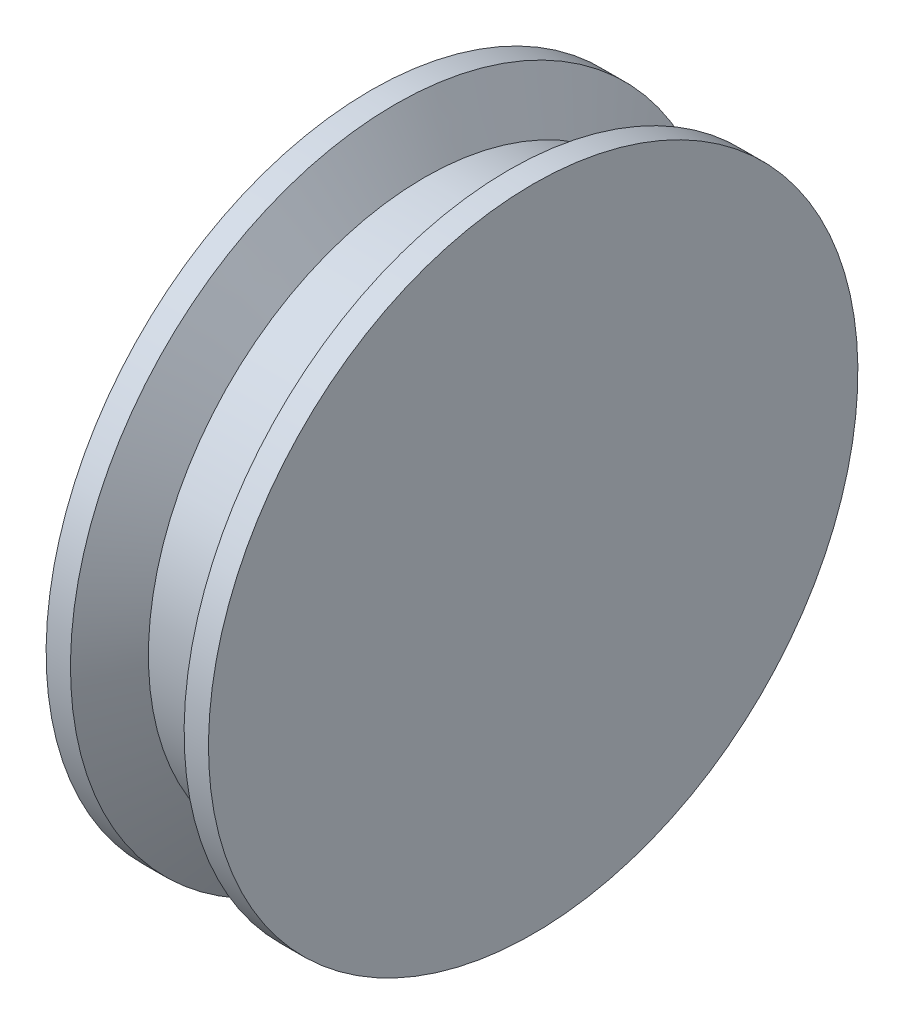
ISO-10303-21;
HEADER;
FILE_DESCRIPTION(('STEP AP214'),'2;1');
FILE_NAME('part.step','',(''),(''),'','','');
FILE_SCHEMA(('AUTOMOTIVE_DESIGN { 1 0 10303 214 1 1 1 1 }'));
ENDSEC;
DATA;
#1=APPLICATION_CONTEXT('core data for automotive mechanical design processes');
#2=APPLICATION_PROTOCOL_DEFINITION('international standard','automotive_design',2000,#1);
#3=PRODUCT_CONTEXT('',#1,'mechanical');
#4=PRODUCT('Part','Part','',(#3));
#5=PRODUCT_RELATED_PRODUCT_CATEGORY('part','',(#4));
#6=PRODUCT_DEFINITION_FORMATION('','',#4);
#7=PRODUCT_DEFINITION_CONTEXT('part definition',#1,'design');
#8=PRODUCT_DEFINITION('design','',#6,#7);
#9=PRODUCT_DEFINITION_SHAPE('','',#8);
#10=(LENGTH_UNIT() NAMED_UNIT(*) SI_UNIT(.MILLI.,.METRE.));
#11=(NAMED_UNIT(*) PLANE_ANGLE_UNIT() SI_UNIT($,.RADIAN.));
#12=(NAMED_UNIT(*) SI_UNIT($,.STERADIAN.) SOLID_ANGLE_UNIT());
#13=UNCERTAINTY_MEASURE_WITH_UNIT(LENGTH_MEASURE(1.E-05),#10,'distance_accuracy_value','');
#14=(GEOMETRIC_REPRESENTATION_CONTEXT(3) GLOBAL_UNCERTAINTY_ASSIGNED_CONTEXT((#13)) GLOBAL_UNIT_ASSIGNED_CONTEXT((#10,
#11,#12)) REPRESENTATION_CONTEXT('',''));
#15=CARTESIAN_POINT('',(0.,0.,0.));
#16=DIRECTION('',(0.,0.,1.));
#17=DIRECTION('',(1.,0.,0.));
#18=AXIS2_PLACEMENT_3D('',#15,#16,#17);
#19=CARTESIAN_POINT('',(-131.316498316498,-36.0083067887729,0.));
#20=DIRECTION('',(-1.,0.,0.));
#21=DIRECTION('',(0.,-1.,0.));
#22=AXIS2_PLACEMENT_3D('',#19,#20,#21);
#23=PLANE('',#22);
#24=CARTESIAN_POINT('',(-131.316498316498,-36.0083067887729,0.));
#25=DIRECTION('',(1.,0.,0.));
#26=DIRECTION('',(0.,1.,0.));
#27=AXIS2_PLACEMENT_3D('',#24,#25,#26);
#28=CIRCLE('',#27,200.);
#29=CARTESIAN_POINT('',(-131.316498316498,163.991693211227,0.));
#30=VERTEX_POINT('',#29);
#31=EDGE_CURVE('E146',#30,#30,#28,.T.);
#32=ORIENTED_EDGE('',*,*,#31,.F.);
#33=EDGE_LOOP('',(#32));
#34=FACE_BOUND('',#33,.T.);
#35=CARTESIAN_POINT('',(-131.316498316498,-36.0083067887729,0.));
#36=DIRECTION('',(-1.,0.,0.));
#37=DIRECTION('',(0.,-1.,0.));
#38=AXIS2_PLACEMENT_3D('',#35,#36,#37);
#39=CIRCLE('',#38,10.);
#40=CARTESIAN_POINT('',(-131.316498316498,-41.0083067887729,-8.66025403784439));
#41=VERTEX_POINT('',#40);
#42=CARTESIAN_POINT('',(-131.316498316498,-31.0083067887729,-8.6602540378444));
#43=VERTEX_POINT('',#42);
#44=EDGE_CURVE('E117',#41,#43,#39,.T.);
#45=ORIENTED_EDGE('',*,*,#44,.F.);
#46=DIRECTION('',(0.,0.,1.));
#47=VECTOR('',#46,1.);
#48=CARTESIAN_POINT('',(-131.316498316498,-41.0083067887729,-14.));
#49=LINE('',#48,#47);
#50=CARTESIAN_POINT('',(-131.316498316498,-41.0083067887729,-14.));
#51=VERTEX_POINT('',#50);
#52=EDGE_CURVE('E94',#51,#41,#49,.T.);
#53=ORIENTED_EDGE('',*,*,#52,.F.);
#54=DIRECTION('',(0.,1.,0.));
#55=VECTOR('',#54,1.);
#56=CARTESIAN_POINT('',(-131.316498316498,7.28952999720633E-13,-14.));
#57=LINE('',#56,#55);
#58=CARTESIAN_POINT('',(-131.316498316498,-31.0083067887729,-14.));
#59=VERTEX_POINT('',#58);
#60=EDGE_CURVE('E87',#51,#59,#57,.T.);
#61=ORIENTED_EDGE('',*,*,#60,.T.);
#62=DIRECTION('',(0.,0.,1.));
#63=VECTOR('',#62,1.);
#64=CARTESIAN_POINT('',(-131.316498316498,-31.0083067887729,-14.));
#65=LINE('',#64,#63);
#66=EDGE_CURVE('E97',#59,#43,#65,.T.);
#67=ORIENTED_EDGE('',*,*,#66,.T.);
#68=EDGE_LOOP('',(#45,#53,#61,#67));
#69=FACE_BOUND('',#68,.T.);
#70=ADVANCED_FACE('F41',(#34,#69),#23,.T.);
#71=CARTESIAN_POINT('',(-91.3164983164983,-36.0083067887728,0.));
#72=DIRECTION('',(-1.,0.,0.));
#73=DIRECTION('',(0.,-1.,0.));
#74=AXIS2_PLACEMENT_3D('',#71,#72,#73);
#75=CYLINDRICAL_SURFACE('',#74,10.);
#76=CARTESIAN_POINT('',(-91.3164983164983,-36.0083067887728,0.));
#77=DIRECTION('',(-1.,0.,0.));
#78=DIRECTION('',(0.,-1.,0.));
#79=AXIS2_PLACEMENT_3D('',#76,#77,#78);
#80=CIRCLE('',#79,10.);
#81=CARTESIAN_POINT('',(-91.3164983164983,-46.0083067887728,0.));
#82=VERTEX_POINT('',#81);
#83=EDGE_CURVE('E120',#82,#82,#80,.T.);
#84=ORIENTED_EDGE('',*,*,#83,.F.);
#85=EDGE_LOOP('',(#84));
#86=FACE_BOUND('',#85,.T.);
#87=DIRECTION('',(-1.,0.,0.));
#88=VECTOR('',#87,1.);
#89=CARTESIAN_POINT('',(-91.3164983164983,-41.0083067887729,-8.66025403784438));
#90=LINE('',#89,#88);
#91=CARTESIAN_POINT('',(-101.316498316498,-41.0083067887729,-8.66025403784438));
#92=VERTEX_POINT('',#91);
#93=EDGE_CURVE('E63',#92,#41,#90,.T.);
#94=ORIENTED_EDGE('',*,*,#93,.T.);
#95=ORIENTED_EDGE('',*,*,#44,.T.);
#96=DIRECTION('',(-1.,0.,0.));
#97=VECTOR('',#96,1.);
#98=CARTESIAN_POINT('',(-91.3164983164983,-31.0083067887729,-8.66025403784441));
#99=LINE('',#98,#97);
#100=CARTESIAN_POINT('',(-101.316498316498,-31.0083067887729,-8.6602540378444));
#101=VERTEX_POINT('',#100);
#102=EDGE_CURVE('E11',#43,#101,#99,.F.);
#103=ORIENTED_EDGE('',*,*,#102,.T.);
#104=CARTESIAN_POINT('',(-101.316498316498,-31.0083067887729,-8.6602540378444));
#105=CARTESIAN_POINT('',(-101.185553457075,-31.0082831747662,-8.66021552033595));
#106=CARTESIAN_POINT('',(-101.054629982263,-31.0134499334058,-8.66322292251227));
#107=CARTESIAN_POINT('',(-100.793926511494,-31.0339784341393,-8.67503956566088));
#108=CARTESIAN_POINT('',(-100.66414586259,-31.0493339124086,-8.68384524194289));
#109=CARTESIAN_POINT('',(-100.407403261575,-31.0899378118031,-8.70690282410306));
#110=CARTESIAN_POINT('',(-100.280429417459,-31.1151290274678,-8.72112322585305));
#111=CARTESIAN_POINT('',(-100.029443051431,-31.1750723583759,-8.75448565934705));
#112=CARTESIAN_POINT('',(-99.9054308714465,-31.2098255718177,-8.77362825639016));
#113=CARTESIAN_POINT('',(-99.5395705265123,-31.3277125700236,-8.83742418586506));
#114=CARTESIAN_POINT('',(-99.3031219511272,-31.4245992069742,-8.88852160837801));
#115=CARTESIAN_POINT('',(-98.8496629532383,-31.6517848718816,-9.00204283953055));
#116=CARTESIAN_POINT('',(-98.6326833590886,-31.7821356715433,-9.06448415391185));
#117=CARTESIAN_POINT('',(-98.2049621942789,-32.0849792557353,-9.19984832177621));
#118=CARTESIAN_POINT('',(-97.9961822715222,-32.2600468042289,-9.27321075223626));
#119=CARTESIAN_POINT('',(-97.6093889678006,-32.6421242581258,-9.4186245679303));
#120=CARTESIAN_POINT('',(-97.4313839339349,-32.8491428008968,-9.49067559274422));
#121=CARTESIAN_POINT('',(-97.1852722945067,-33.1879741621137,-9.5948442553227));
#122=CARTESIAN_POINT('',(-97.104585925138,-33.3099237169127,-9.62993521302806));
#123=CARTESIAN_POINT('',(-96.953870889154,-33.5610832961431,-9.69680101193731));
#124=CARTESIAN_POINT('',(-96.8838379989103,-33.6902904153103,-9.72857716573445));
#125=CARTESIAN_POINT('',(-96.7551232328078,-33.9551302811057,-9.7878946678277));
#126=CARTESIAN_POINT('',(-96.6964385104885,-34.0907614057471,-9.81543707771721));
#127=CARTESIAN_POINT('',(-96.5910676555497,-34.3675087462858,-9.86547225261225));
#128=CARTESIAN_POINT('',(-96.5443802474515,-34.5086243772671,-9.88796555437484));
#129=CARTESIAN_POINT('',(-96.4664831104079,-34.7850013354591,-9.92580345064966));
#130=CARTESIAN_POINT('',(-96.4344087311045,-34.9199652095616,-9.94154270016939));
#131=CARTESIAN_POINT('',(-96.3815326605929,-35.1925931192453,-9.96761533354204));
#132=CARTESIAN_POINT('',(-96.3607298717258,-35.3302568905497,-9.97794924377855));
#133=CARTESIAN_POINT('',(-96.3306788313793,-35.6070840437491,-9.99290878928165));
#134=CARTESIAN_POINT('',(-96.321425190984,-35.7462466956583,-9.99753708681582));
#135=CARTESIAN_POINT('',(-96.3145839436851,-36.0249265456255,-10.0009568325234));
#136=CARTESIAN_POINT('',(-96.3169956231585,-36.1644437214738,-9.99974863774268));
#137=CARTESIAN_POINT('',(-96.3327289912226,-36.4304662895649,-9.99189259522169));
#138=CARTESIAN_POINT('',(-96.345080323496,-36.5570447777076,-9.98572860401049));
#139=CARTESIAN_POINT('',(-96.3793316349545,-36.8086239319884,-9.96872078084596));
#140=CARTESIAN_POINT('',(-96.4012346290839,-36.9336240871028,-9.95787547126404));
#141=CARTESIAN_POINT('',(-96.4543459880479,-37.1811162883584,-9.93176665601098));
#142=CARTESIAN_POINT('',(-96.4855510621534,-37.3036092051177,-9.91650471283579));
#143=CARTESIAN_POINT('',(-96.5569467373225,-37.5453765483616,-9.88192118125886));
#144=CARTESIAN_POINT('',(-96.5971407798692,-37.6646497224943,-9.86259803817218));
#145=CARTESIAN_POINT('',(-96.7318721883969,-38.0197084294305,-9.79859254190634));
#146=CARTESIAN_POINT('',(-96.8398656768762,-38.2495305863827,-9.74822697051343));
#147=CARTESIAN_POINT('',(-97.0878259301008,-38.688227625834,-9.63687905561348));
#148=CARTESIAN_POINT('',(-97.2278046135571,-38.8970946579232,-9.57589275650221));
#149=CARTESIAN_POINT('',(-97.5509508759955,-39.3091435553731,-9.44222809770672));
#150=CARTESIAN_POINT('',(-97.7369488980613,-39.5099252650299,-9.36898946989682));
#151=CARTESIAN_POINT('',(-98.1394592925036,-39.878832681503,-9.22271533381488));
#152=CARTESIAN_POINT('',(-98.3559988354557,-40.0469289902786,-9.14968006610292));
#153=CARTESIAN_POINT('',(-98.7077770253474,-40.2763161518171,-9.04388357914141));
#154=CARTESIAN_POINT('',(-98.8337249446879,-40.3508113479852,-9.00825027478856));
#155=CARTESIAN_POINT('',(-99.0923732496891,-40.4887896548392,-8.94042357322576));
#156=CARTESIAN_POINT('',(-99.2250706326631,-40.552277607932,-8.90822866577079));
#157=CARTESIAN_POINT('',(-99.4961977422676,-40.6675083640461,-8.84850577092727));
#158=CARTESIAN_POINT('',(-99.6346166012948,-40.719272324034,-8.820969399907));
#159=CARTESIAN_POINT('',(-99.9163501054739,-40.8105474179167,-8.77161166383331));
#160=CARTESIAN_POINT('',(-100.059662599315,-40.8500638609259,-8.74978782312347));
#161=CARTESIAN_POINT('',(-100.385987488335,-40.9244613215098,-8.70825525914845));
#162=CARTESIAN_POINT('',(-100.570076346033,-40.9557973728623,-8.69039463239672));
#163=CARTESIAN_POINT('',(-100.84856771047,-40.9872442984279,-8.67238767476002));
#164=CARTESIAN_POINT('',(-100.941889178356,-40.9951338297987,-8.66784921973963));
#165=CARTESIAN_POINT('',(-101.128963001843,-41.0056669261562,-8.66177877348574));
#166=CARTESIAN_POINT('',(-101.222715517926,-41.0083083462979,-8.66024801146593));
#167=CARTESIAN_POINT('',(-101.316498316498,-41.0083067887729,-8.66025403784437));
#168=B_SPLINE_CURVE_WITH_KNOTS('',3,(#104,#105,#106,#107,#108,#109,#110,#111,#112,#113,#114,
#115,#116,#117,#118,#119,#120,#121,#122,#123,#124,#125,#126,#127,#128,#129,#130,#131,#132,#133,
#134,#135,#136,#137,#138,#139,#140,#141,#142,#143,#144,#145,#146,#147,#148,#149,#150,#151,#152,
#153,#154,#155,#156,#157,#158,#159,#160,#161,#162,#163,#164,#165,#166,#167),.UNSPECIFIED.,.F.,
.F.,(4,2,2,2,2,2,2,2,2,2,2,2,2,2,2,2,2,2,2,2,2,2,2,2,2,2,2,2,2,2,2,4),(0.,0.39266311107423,
0.785085043976632,1.17525782500547,1.56547543621649,2.34356953597109,3.12287474023973,
3.96591805439186,4.80918967038283,5.2598277560852,5.71028671567882,6.16063253969346,
6.61093046596311,7.02920191619562,7.44743262666621,7.86546811463041,8.28347802970753,
8.66501292889446,9.04666834532888,9.42818890621363,9.80985578547376,10.5829611793111,
11.3563551282125,12.2027949390745,13.0499925721764,13.5013153935383,13.9524391582349,
14.4027422267378,14.8528498217362,15.4139318158641,15.695056461108,15.9762959752701),.UNSPECIFIED.);
#169=EDGE_CURVE('E49',#101,#92,#168,.T.);
#170=ORIENTED_EDGE('',*,*,#169,.T.);
#171=EDGE_LOOP('',(#94,#95,#103,#170));
#172=FACE_BOUND('',#171,.T.);
#173=ADVANCED_FACE('F158',(#86,#172),#75,.F.);
#174=CARTESIAN_POINT('',(-31.3164983164984,-36.0083067887728,0.));
#175=DIRECTION('',(1.,0.,0.));
#176=DIRECTION('',(0.,1.,0.));
#177=AXIS2_PLACEMENT_3D('',#174,#175,#176);
#178=CYLINDRICAL_SURFACE('',#177,200.);
#179=ORIENTED_EDGE('',*,*,#31,.T.);
#180=EDGE_LOOP('',(#179));
#181=FACE_BOUND('',#180,.T.);
#182=CARTESIAN_POINT('',(-116.316498316498,-36.0083067887729,0.));
#183=DIRECTION('',(1.,0.,0.));
#184=DIRECTION('',(0.,1.,0.));
#185=AXIS2_PLACEMENT_3D('',#182,#183,#184);
#186=CIRCLE('',#185,200.);
#187=CARTESIAN_POINT('',(-116.316498316498,163.991693211227,0.));
#188=VERTEX_POINT('',#187);
#189=EDGE_CURVE('E142',#188,#188,#186,.T.);
#190=ORIENTED_EDGE('',*,*,#189,.F.);
#191=EDGE_LOOP('',(#190));
#192=FACE_BOUND('',#191,.T.);
#193=ADVANCED_FACE('F185',(#181,#192),#178,.T.);
#194=CARTESIAN_POINT('',(-98.3164983164983,-36.0083067887728,0.));
#195=DIRECTION('',(-1.,0.,0.));
#196=DIRECTION('',(0.,-1.,0.));
#197=AXIS2_PLACEMENT_3D('',#194,#195,#196);
#198=CONICAL_SURFACE('',#197,170.,1.03037682652431);
#199=ORIENTED_EDGE('',*,*,#189,.T.);
#200=EDGE_LOOP('',(#199));
#201=FACE_BOUND('',#200,.T.);
#202=CARTESIAN_POINT('',(-98.3164983164983,-36.0083067887728,0.));
#203=DIRECTION('',(1.,0.,0.));
#204=DIRECTION('',(0.,1.,0.));
#205=AXIS2_PLACEMENT_3D('',#202,#203,#204);
#206=CIRCLE('',#205,170.);
#207=CARTESIAN_POINT('',(-98.3164983164984,133.991693211227,0.));
#208=VERTEX_POINT('',#207);
#209=EDGE_CURVE('E138',#208,#208,#206,.T.);
#210=ORIENTED_EDGE('',*,*,#209,.F.);
#211=EDGE_LOOP('',(#210));
#212=FACE_BOUND('',#211,.T.);
#213=ADVANCED_FACE('F191',(#201,#212),#198,.T.);
#214=CARTESIAN_POINT('',(-31.3164983164984,-36.0083067887728,0.));
#215=DIRECTION('',(1.,0.,0.));
#216=DIRECTION('',(0.,1.,0.));
#217=AXIS2_PLACEMENT_3D('',#214,#215,#216);
#218=CYLINDRICAL_SURFACE('',#217,170.);
#219=ORIENTED_EDGE('',*,*,#209,.T.);
#220=EDGE_LOOP('',(#219));
#221=FACE_BOUND('',#220,.T.);
#222=CARTESIAN_POINT('',(-64.3164983164983,-36.0083067887728,0.));
#223=DIRECTION('',(1.,0.,0.));
#224=DIRECTION('',(0.,1.,0.));
#225=AXIS2_PLACEMENT_3D('',#222,#223,#224);
#226=CIRCLE('',#225,170.);
#227=CARTESIAN_POINT('',(-64.3164983164984,133.991693211227,0.));
#228=VERTEX_POINT('',#227);
#229=EDGE_CURVE('E134',#228,#228,#226,.T.);
#230=ORIENTED_EDGE('',*,*,#229,.F.);
#231=EDGE_LOOP('',(#230));
#232=FACE_BOUND('',#231,.T.);
#233=ADVANCED_FACE('F196',(#221,#232),#218,.T.);
#234=CARTESIAN_POINT('',(-46.3164983164983,-36.0083067887728,0.));
#235=DIRECTION('',(1.,0.,0.));
#236=DIRECTION('',(0.,1.,0.));
#237=AXIS2_PLACEMENT_3D('',#234,#235,#236);
#238=CONICAL_SURFACE('',#237,200.,1.03037682652431);
#239=ORIENTED_EDGE('',*,*,#229,.T.);
#240=EDGE_LOOP('',(#239));
#241=FACE_BOUND('',#240,.T.);
#242=CARTESIAN_POINT('',(-46.3164983164983,-36.0083067887728,0.));
#243=DIRECTION('',(1.,0.,0.));
#244=DIRECTION('',(0.,1.,0.));
#245=AXIS2_PLACEMENT_3D('',#242,#243,#244);
#246=CIRCLE('',#245,200.);
#247=CARTESIAN_POINT('',(-46.3164983164984,163.991693211227,0.));
#248=VERTEX_POINT('',#247);
#249=EDGE_CURVE('E130',#248,#248,#246,.T.);
#250=ORIENTED_EDGE('',*,*,#249,.F.);
#251=EDGE_LOOP('',(#250));
#252=FACE_BOUND('',#251,.T.);
#253=ADVANCED_FACE('F202',(#241,#252),#238,.T.);
#254=CARTESIAN_POINT('',(-31.3164983164984,-36.0083067887728,0.));
#255=DIRECTION('',(1.,0.,0.));
#256=DIRECTION('',(0.,1.,0.));
#257=AXIS2_PLACEMENT_3D('',#254,#255,#256);
#258=CYLINDRICAL_SURFACE('',#257,200.);
#259=ORIENTED_EDGE('',*,*,#249,.T.);
#260=EDGE_LOOP('',(#259));
#261=FACE_BOUND('',#260,.T.);
#262=CARTESIAN_POINT('',(-31.3164983164983,-36.0083067887728,0.));
#263=DIRECTION('',(1.,0.,0.));
#264=DIRECTION('',(0.,1.,0.));
#265=AXIS2_PLACEMENT_3D('',#262,#263,#264);
#266=CIRCLE('',#265,200.);
#267=CARTESIAN_POINT('',(-31.3164983164984,163.991693211227,0.));
#268=VERTEX_POINT('',#267);
#269=EDGE_CURVE('E124',#268,#268,#266,.T.);
#270=ORIENTED_EDGE('',*,*,#269,.F.);
#271=EDGE_LOOP('',(#270));
#272=FACE_BOUND('',#271,.T.);
#273=ADVANCED_FACE('F178',(#261,#272),#258,.T.);
#274=CARTESIAN_POINT('',(-31.3164983164984,163.991693211227,0.));
#275=DIRECTION('',(1.,0.,0.));
#276=DIRECTION('',(0.,1.,0.));
#277=AXIS2_PLACEMENT_3D('',#274,#275,#276);
#278=PLANE('',#277);
#279=ORIENTED_EDGE('',*,*,#269,.T.);
#280=EDGE_LOOP('',(#279));
#281=FACE_BOUND('',#280,.T.);
#282=ADVANCED_FACE('F173',(#281),#278,.T.);
#283=CARTESIAN_POINT('',(-91.3164983164983,-36.0083067887728,0.));
#284=DIRECTION('',(-1.,0.,0.));
#285=DIRECTION('',(0.,-1.,0.));
#286=AXIS2_PLACEMENT_3D('',#283,#284,#285);
#287=PLANE('',#286);
#288=ORIENTED_EDGE('',*,*,#83,.T.);
#289=EDGE_LOOP('',(#288));
#290=FACE_BOUND('',#289,.T.);
#291=ADVANCED_FACE('F171',(#290),#287,.T.);
#292=CARTESIAN_POINT('',(0.,-31.0083067887729,-14.));
#293=DIRECTION('',(0.,1.,0.));
#294=DIRECTION('',(-1.,0.,0.));
#295=AXIS2_PLACEMENT_3D('',#292,#293,#294);
#296=PLANE('',#295);
#297=ORIENTED_EDGE('',*,*,#102,.F.);
#298=ORIENTED_EDGE('',*,*,#66,.F.);
#299=DIRECTION('',(-1.,0.,0.));
#300=VECTOR('',#299,1.);
#301=CARTESIAN_POINT('',(0.,-31.0083067887729,-14.));
#302=LINE('',#301,#300);
#303=CARTESIAN_POINT('',(-101.316498316498,-31.0083067887729,-14.));
#304=VERTEX_POINT('',#303);
#305=EDGE_CURVE('E82',#304,#59,#302,.T.);
#306=ORIENTED_EDGE('',*,*,#305,.F.);
#307=DIRECTION('',(0.,0.,1.));
#308=VECTOR('',#307,1.);
#309=CARTESIAN_POINT('',(-101.316498316498,-31.0083067887729,-14.));
#310=LINE('',#309,#308);
#311=EDGE_CURVE('E114',#304,#101,#310,.T.);
#312=ORIENTED_EDGE('',*,*,#311,.T.);
#313=EDGE_LOOP('',(#297,#298,#306,#312));
#314=FACE_BOUND('',#313,.T.);
#315=ADVANCED_FACE('F98',(#314),#296,.F.);
#316=CARTESIAN_POINT('',(-101.316498316498,-36.0083067887729,-14.));
#317=DIRECTION('',(0.,0.,1.));
#318=DIRECTION('',(1.,0.,0.));
#319=AXIS2_PLACEMENT_3D('',#316,#317,#318);
#320=CYLINDRICAL_SURFACE('',#319,5.);
#321=ORIENTED_EDGE('',*,*,#311,.F.);
#322=CARTESIAN_POINT('',(-101.316498316498,-36.0083067887729,-14.));
#323=DIRECTION('',(0.,0.,1.));
#324=DIRECTION('',(1.,0.,0.));
#325=AXIS2_PLACEMENT_3D('',#322,#323,#324);
#326=CIRCLE('',#325,5.);
#327=CARTESIAN_POINT('',(-101.316498316498,-41.0083067887729,-14.));
#328=VERTEX_POINT('',#327);
#329=EDGE_CURVE('E90',#328,#304,#326,.T.);
#330=ORIENTED_EDGE('',*,*,#329,.F.);
#331=DIRECTION('',(0.,0.,1.));
#332=VECTOR('',#331,1.);
#333=CARTESIAN_POINT('',(-101.316498316498,-41.0083067887729,-14.));
#334=LINE('',#333,#332);
#335=EDGE_CURVE('E113',#328,#92,#334,.T.);
#336=ORIENTED_EDGE('',*,*,#335,.T.);
#337=ORIENTED_EDGE('',*,*,#169,.F.);
#338=EDGE_LOOP('',(#321,#330,#336,#337));
#339=FACE_BOUND('',#338,.T.);
#340=ADVANCED_FACE('F162',(#339),#320,.F.);
#341=CARTESIAN_POINT('',(0.,-41.0083067887729,-14.));
#342=DIRECTION('',(0.,-1.,0.));
#343=DIRECTION('',(0.,0.,-1.));
#344=AXIS2_PLACEMENT_3D('',#341,#342,#343);
#345=PLANE('',#344);
#346=ORIENTED_EDGE('',*,*,#335,.F.);
#347=DIRECTION('',(1.,0.,0.));
#348=VECTOR('',#347,1.);
#349=CARTESIAN_POINT('',(0.,-41.0083067887729,-14.));
#350=LINE('',#349,#348);
#351=EDGE_CURVE('E93',#51,#328,#350,.T.);
#352=ORIENTED_EDGE('',*,*,#351,.F.);
#353=ORIENTED_EDGE('',*,*,#52,.T.);
#354=ORIENTED_EDGE('',*,*,#93,.F.);
#355=EDGE_LOOP('',(#346,#352,#353,#354));
#356=FACE_BOUND('',#355,.T.);
#357=ADVANCED_FACE('F167',(#356),#345,.F.);
#358=CARTESIAN_POINT('',(0.,0.,-14.));
#359=DIRECTION('',(0.,0.,1.));
#360=DIRECTION('',(1.,0.,0.));
#361=AXIS2_PLACEMENT_3D('',#358,#359,#360);
#362=PLANE('',#361);
#363=ORIENTED_EDGE('',*,*,#305,.T.);
#364=ORIENTED_EDGE('',*,*,#60,.F.);
#365=ORIENTED_EDGE('',*,*,#351,.T.);
#366=ORIENTED_EDGE('',*,*,#329,.T.);
#367=EDGE_LOOP('',(#363,#364,#365,#366));
#368=FACE_BOUND('',#367,.T.);
#369=ADVANCED_FACE('F84',(#368),#362,.T.);
#370=CLOSED_SHELL('',(#70,#173,#193,#213,#233,#253,#273,#282,#291,#315,#340,#357,#369));
#371=MANIFOLD_SOLID_BREP('B2',#370);
#372=ADVANCED_BREP_SHAPE_REPRESENTATION('',(#18,#371),#14);
#373=SHAPE_DEFINITION_REPRESENTATION(#9,#372);
ENDSEC;
END-ISO-10303-21;
